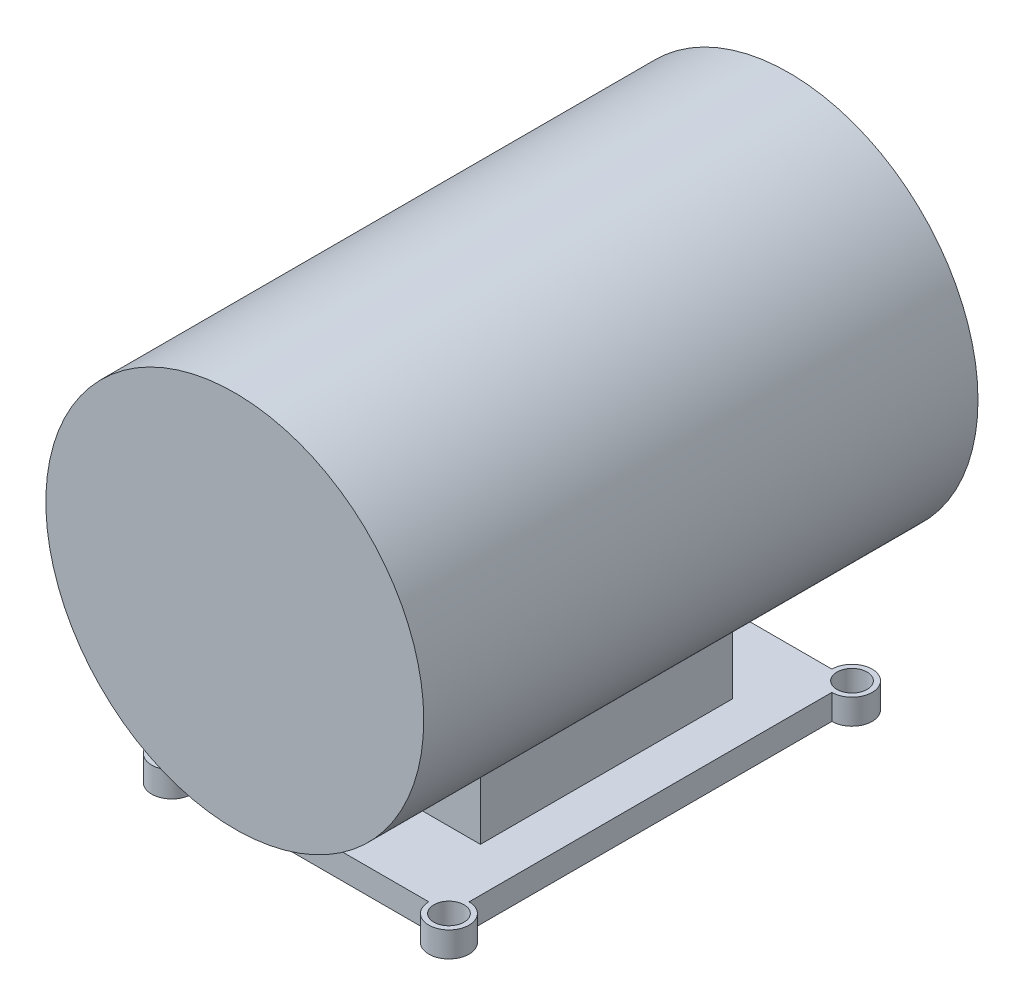
ISO-10303-21;
HEADER;
FILE_DESCRIPTION(('STEP AP214'),'2;1');
FILE_NAME('part.step','',(''),(''),'','','');
FILE_SCHEMA(('AUTOMOTIVE_DESIGN { 1 0 10303 214 1 1 1 1 }'));
ENDSEC;
DATA;
#1=APPLICATION_CONTEXT('core data for automotive mechanical design processes');
#2=APPLICATION_PROTOCOL_DEFINITION('international standard','automotive_design',2000,#1);
#3=PRODUCT_CONTEXT('',#1,'mechanical');
#4=PRODUCT('Part','Part','',(#3));
#5=PRODUCT_RELATED_PRODUCT_CATEGORY('part','',(#4));
#6=PRODUCT_DEFINITION_FORMATION('','',#4);
#7=PRODUCT_DEFINITION_CONTEXT('part definition',#1,'design');
#8=PRODUCT_DEFINITION('design','',#6,#7);
#9=PRODUCT_DEFINITION_SHAPE('','',#8);
#10=(LENGTH_UNIT() NAMED_UNIT(*) SI_UNIT(.MILLI.,.METRE.));
#11=(NAMED_UNIT(*) PLANE_ANGLE_UNIT() SI_UNIT($,.RADIAN.));
#12=(NAMED_UNIT(*) SI_UNIT($,.STERADIAN.) SOLID_ANGLE_UNIT());
#13=UNCERTAINTY_MEASURE_WITH_UNIT(LENGTH_MEASURE(1.E-05),#10,'distance_accuracy_value','');
#14=(GEOMETRIC_REPRESENTATION_CONTEXT(3) GLOBAL_UNCERTAINTY_ASSIGNED_CONTEXT((#13)) GLOBAL_UNIT_ASSIGNED_CONTEXT((#10,
#11,#12)) REPRESENTATION_CONTEXT('',''));
#15=CARTESIAN_POINT('',(0.,0.,0.));
#16=DIRECTION('',(0.,0.,1.));
#17=DIRECTION('',(1.,0.,0.));
#18=AXIS2_PLACEMENT_3D('',#15,#16,#17);
#19=CARTESIAN_POINT('',(55.,5.,-80.));
#20=DIRECTION('',(0.,1.,0.));
#21=DIRECTION('',(0.,0.,1.));
#22=AXIS2_PLACEMENT_3D('',#19,#20,#21);
#23=PLANE('',#22);
#24=CARTESIAN_POINT('',(-55.,5.,-80.));
#25=DIRECTION('',(0.,1.,0.));
#26=DIRECTION('',(0.,0.,1.));
#27=AXIS2_PLACEMENT_3D('',#24,#25,#26);
#28=CIRCLE('',#27,6.);
#29=CARTESIAN_POINT('',(-55.,5.,-74.));
#30=VERTEX_POINT('',#29);
#31=EDGE_CURVE('E168',#30,#30,#28,.T.);
#32=ORIENTED_EDGE('',*,*,#31,.F.);
#33=EDGE_LOOP('',(#32));
#34=FACE_BOUND('',#33,.T.);
#35=CARTESIAN_POINT('',(55.,5.,-80.));
#36=DIRECTION('',(0.,1.,0.));
#37=DIRECTION('',(0.,0.,1.));
#38=AXIS2_PLACEMENT_3D('',#35,#36,#37);
#39=CIRCLE('',#38,6.);
#40=CARTESIAN_POINT('',(55.,5.,-74.));
#41=VERTEX_POINT('',#40);
#42=EDGE_CURVE('E184',#41,#41,#39,.T.);
#43=ORIENTED_EDGE('',*,*,#42,.F.);
#44=EDGE_LOOP('',(#43));
#45=FACE_BOUND('',#44,.T.);
#46=CARTESIAN_POINT('',(55.,5.,-80.));
#47=DIRECTION('',(0.,1.,0.));
#48=DIRECTION('',(0.,0.,1.));
#49=AXIS2_PLACEMENT_3D('',#46,#47,#48);
#50=CIRCLE('',#49,8.00000000000001);
#51=CARTESIAN_POINT('',(55.,5.,-72.));
#52=VERTEX_POINT('',#51);
#53=CARTESIAN_POINT('',(47.,5.,-80.));
#54=VERTEX_POINT('',#53);
#55=EDGE_CURVE('E192',#52,#54,#50,.T.);
#56=ORIENTED_EDGE('',*,*,#55,.T.);
#57=DIRECTION('',(-1.,0.,0.));
#58=VECTOR('',#57,1.);
#59=CARTESIAN_POINT('',(-47.,5.,-80.));
#60=LINE('',#59,#58);
#61=CARTESIAN_POINT('',(-47.,5.,-80.));
#62=VERTEX_POINT('',#61);
#63=EDGE_CURVE('E196',#54,#62,#60,.T.);
#64=ORIENTED_EDGE('',*,*,#63,.T.);
#65=CARTESIAN_POINT('',(-55.,5.,-80.));
#66=DIRECTION('',(0.,1.,0.));
#67=DIRECTION('',(0.,0.,1.));
#68=AXIS2_PLACEMENT_3D('',#65,#66,#67);
#69=CIRCLE('',#68,8.);
#70=CARTESIAN_POINT('',(-55.,5.,-72.));
#71=VERTEX_POINT('',#70);
#72=EDGE_CURVE('E200',#62,#71,#69,.T.);
#73=ORIENTED_EDGE('',*,*,#72,.T.);
#74=DIRECTION('',(0.,0.,1.));
#75=VECTOR('',#74,1.);
#76=CARTESIAN_POINT('',(-55.,5.,-72.));
#77=LINE('',#76,#75);
#78=CARTESIAN_POINT('',(-55.,5.,71.9999999999999));
#79=VERTEX_POINT('',#78);
#80=EDGE_CURVE('E203',#71,#79,#77,.T.);
#81=ORIENTED_EDGE('',*,*,#80,.T.);
#82=CARTESIAN_POINT('',(-55.,5.,80.));
#83=DIRECTION('',(0.,1.,0.));
#84=DIRECTION('',(0.,0.,-1.));
#85=AXIS2_PLACEMENT_3D('',#82,#83,#84);
#86=CIRCLE('',#85,8.00000000000003);
#87=CARTESIAN_POINT('',(-47.,5.,79.9999999999999));
#88=VERTEX_POINT('',#87);
#89=EDGE_CURVE('E206',#79,#88,#86,.T.);
#90=ORIENTED_EDGE('',*,*,#89,.T.);
#91=DIRECTION('',(1.,0.,0.));
#92=VECTOR('',#91,1.);
#93=CARTESIAN_POINT('',(-47.,5.,79.9999999999999));
#94=LINE('',#93,#92);
#95=CARTESIAN_POINT('',(47.,5.,79.9999999999999));
#96=VERTEX_POINT('',#95);
#97=EDGE_CURVE('E209',#88,#96,#94,.T.);
#98=ORIENTED_EDGE('',*,*,#97,.T.);
#99=CARTESIAN_POINT('',(55.,5.,80.));
#100=DIRECTION('',(0.,1.,0.));
#101=DIRECTION('',(0.,0.,-1.));
#102=AXIS2_PLACEMENT_3D('',#99,#100,#101);
#103=CIRCLE('',#102,8.00000000000006);
#104=CARTESIAN_POINT('',(55.,5.,72.));
#105=VERTEX_POINT('',#104);
#106=EDGE_CURVE('E212',#96,#105,#103,.T.);
#107=ORIENTED_EDGE('',*,*,#106,.T.);
#108=DIRECTION('',(0.,0.,-1.));
#109=VECTOR('',#108,1.);
#110=CARTESIAN_POINT('',(55.,5.,-72.));
#111=LINE('',#110,#109);
#112=EDGE_CURVE('E215',#105,#52,#111,.T.);
#113=ORIENTED_EDGE('',*,*,#112,.T.);
#114=EDGE_LOOP('',(#56,#64,#73,#81,#90,#98,#107,#113));
#115=FACE_BOUND('',#114,.T.);
#116=CARTESIAN_POINT('',(55.,5.,80.));
#117=DIRECTION('',(0.,1.,0.));
#118=DIRECTION('',(0.,0.,-1.));
#119=AXIS2_PLACEMENT_3D('',#116,#117,#118);
#120=CIRCLE('',#119,5.99999999999995);
#121=CARTESIAN_POINT('',(55.,5.,74.0000000000001));
#122=VERTEX_POINT('',#121);
#123=EDGE_CURVE('E176',#122,#122,#120,.T.);
#124=ORIENTED_EDGE('',*,*,#123,.F.);
#125=EDGE_LOOP('',(#124));
#126=FACE_BOUND('',#125,.T.);
#127=CARTESIAN_POINT('',(-55.,5.,80.));
#128=DIRECTION('',(0.,1.,0.));
#129=DIRECTION('',(0.,0.,-1.));
#130=AXIS2_PLACEMENT_3D('',#127,#128,#129);
#131=CIRCLE('',#130,5.99999999999995);
#132=CARTESIAN_POINT('',(-55.,5.,74.0000000000001));
#133=VERTEX_POINT('',#132);
#134=EDGE_CURVE('E160',#133,#133,#131,.T.);
#135=ORIENTED_EDGE('',*,*,#134,.F.);
#136=EDGE_LOOP('',(#135));
#137=FACE_BOUND('',#136,.T.);
#138=DIRECTION('',(-1.,0.,0.));
#139=VECTOR('',#138,1.);
#140=CARTESIAN_POINT('',(-37.5,5.,-50.));
#141=LINE('',#140,#139);
#142=CARTESIAN_POINT('',(37.5,5.,-50.));
#143=VERTEX_POINT('',#142);
#144=CARTESIAN_POINT('',(-37.5,5.,-50.));
#145=VERTEX_POINT('',#144);
#146=EDGE_CURVE('E514',#143,#145,#141,.T.);
#147=ORIENTED_EDGE('',*,*,#146,.F.);
#148=DIRECTION('',(0.,0.,-1.));
#149=VECTOR('',#148,1.);
#150=CARTESIAN_POINT('',(37.5,5.,-50.));
#151=LINE('',#150,#149);
#152=CARTESIAN_POINT('',(37.5,5.,50.));
#153=VERTEX_POINT('',#152);
#154=EDGE_CURVE('E138',#153,#143,#151,.T.);
#155=ORIENTED_EDGE('',*,*,#154,.F.);
#156=DIRECTION('',(1.,0.,0.));
#157=VECTOR('',#156,1.);
#158=CARTESIAN_POINT('',(-37.5,5.,50.));
#159=LINE('',#158,#157);
#160=CARTESIAN_POINT('',(-37.5,5.,50.));
#161=VERTEX_POINT('',#160);
#162=EDGE_CURVE('E143',#161,#153,#159,.T.);
#163=ORIENTED_EDGE('',*,*,#162,.F.);
#164=DIRECTION('',(0.,0.,1.));
#165=VECTOR('',#164,1.);
#166=CARTESIAN_POINT('',(-37.5,5.,-50.));
#167=LINE('',#166,#165);
#168=EDGE_CURVE('E151',#145,#161,#167,.T.);
#169=ORIENTED_EDGE('',*,*,#168,.F.);
#170=EDGE_LOOP('',(#147,#155,#163,#169));
#171=FACE_BOUND('',#170,.T.);
#172=ADVANCED_FACE('F39',(#34,#45,#115,#126,#137,#171),#23,.T.);
#173=CARTESIAN_POINT('',(55.,-5.,-80.));
#174=DIRECTION('',(0.,1.,0.));
#175=DIRECTION('',(0.,0.,1.));
#176=AXIS2_PLACEMENT_3D('',#173,#174,#175);
#177=PLANE('',#176);
#178=CARTESIAN_POINT('',(55.,-5.,-80.));
#179=DIRECTION('',(0.,1.,0.));
#180=DIRECTION('',(0.,0.,1.));
#181=AXIS2_PLACEMENT_3D('',#178,#179,#180);
#182=CIRCLE('',#181,8.00000000000001);
#183=CARTESIAN_POINT('',(55.,-5.,-72.));
#184=VERTEX_POINT('',#183);
#185=CARTESIAN_POINT('',(47.,-5.,-80.));
#186=VERTEX_POINT('',#185);
#187=EDGE_CURVE('E188',#184,#186,#182,.T.);
#188=ORIENTED_EDGE('',*,*,#187,.F.);
#189=DIRECTION('',(0.,0.,-1.));
#190=VECTOR('',#189,1.);
#191=CARTESIAN_POINT('',(55.,-5.,-72.));
#192=LINE('',#191,#190);
#193=CARTESIAN_POINT('',(55.,-5.,72.));
#194=VERTEX_POINT('',#193);
#195=EDGE_CURVE('E197',#194,#184,#192,.T.);
#196=ORIENTED_EDGE('',*,*,#195,.F.);
#197=CARTESIAN_POINT('',(55.,-5.,80.));
#198=DIRECTION('',(0.,1.,0.));
#199=DIRECTION('',(0.,0.,-1.));
#200=AXIS2_PLACEMENT_3D('',#197,#198,#199);
#201=CIRCLE('',#200,8.00000000000006);
#202=CARTESIAN_POINT('',(47.,-5.,79.9999999999999));
#203=VERTEX_POINT('',#202);
#204=EDGE_CURVE('E237',#203,#194,#201,.T.);
#205=ORIENTED_EDGE('',*,*,#204,.F.);
#206=DIRECTION('',(1.,0.,0.));
#207=VECTOR('',#206,1.);
#208=CARTESIAN_POINT('',(-47.,-5.,79.9999999999999));
#209=LINE('',#208,#207);
#210=CARTESIAN_POINT('',(-47.,-5.,79.9999999999999));
#211=VERTEX_POINT('',#210);
#212=EDGE_CURVE('E234',#211,#203,#209,.T.);
#213=ORIENTED_EDGE('',*,*,#212,.F.);
#214=CARTESIAN_POINT('',(-55.,-5.,80.));
#215=DIRECTION('',(0.,1.,0.));
#216=DIRECTION('',(0.,0.,-1.));
#217=AXIS2_PLACEMENT_3D('',#214,#215,#216);
#218=CIRCLE('',#217,8.00000000000003);
#219=CARTESIAN_POINT('',(-55.,-5.,71.9999999999999));
#220=VERTEX_POINT('',#219);
#221=EDGE_CURVE('E231',#220,#211,#218,.T.);
#222=ORIENTED_EDGE('',*,*,#221,.F.);
#223=DIRECTION('',(0.,0.,1.));
#224=VECTOR('',#223,1.);
#225=CARTESIAN_POINT('',(-55.,-5.,-72.));
#226=LINE('',#225,#224);
#227=CARTESIAN_POINT('',(-55.,-5.,-72.));
#228=VERTEX_POINT('',#227);
#229=EDGE_CURVE('E228',#228,#220,#226,.T.);
#230=ORIENTED_EDGE('',*,*,#229,.F.);
#231=CARTESIAN_POINT('',(-55.,-5.,-80.));
#232=DIRECTION('',(0.,1.,0.));
#233=DIRECTION('',(0.,0.,1.));
#234=AXIS2_PLACEMENT_3D('',#231,#232,#233);
#235=CIRCLE('',#234,8.);
#236=CARTESIAN_POINT('',(-47.,-5.,-80.));
#237=VERTEX_POINT('',#236);
#238=EDGE_CURVE('E225',#237,#228,#235,.T.);
#239=ORIENTED_EDGE('',*,*,#238,.F.);
#240=DIRECTION('',(-1.,0.,0.));
#241=VECTOR('',#240,1.);
#242=CARTESIAN_POINT('',(-47.,-5.,-80.));
#243=LINE('',#242,#241);
#244=EDGE_CURVE('E222',#186,#237,#243,.T.);
#245=ORIENTED_EDGE('',*,*,#244,.F.);
#246=EDGE_LOOP('',(#188,#196,#205,#213,#222,#230,#239,#245));
#247=FACE_BOUND('',#246,.T.);
#248=CARTESIAN_POINT('',(55.,-5.,-80.));
#249=DIRECTION('',(0.,1.,0.));
#250=DIRECTION('',(0.,0.,1.));
#251=AXIS2_PLACEMENT_3D('',#248,#249,#250);
#252=CIRCLE('',#251,6.);
#253=CARTESIAN_POINT('',(55.,-5.,-74.));
#254=VERTEX_POINT('',#253);
#255=EDGE_CURVE('E180',#254,#254,#252,.T.);
#256=ORIENTED_EDGE('',*,*,#255,.T.);
#257=EDGE_LOOP('',(#256));
#258=FACE_BOUND('',#257,.T.);
#259=CARTESIAN_POINT('',(55.,-5.,80.));
#260=DIRECTION('',(0.,1.,0.));
#261=DIRECTION('',(0.,0.,-1.));
#262=AXIS2_PLACEMENT_3D('',#259,#260,#261);
#263=CIRCLE('',#262,5.99999999999995);
#264=CARTESIAN_POINT('',(55.,-5.,74.0000000000001));
#265=VERTEX_POINT('',#264);
#266=EDGE_CURVE('E172',#265,#265,#263,.T.);
#267=ORIENTED_EDGE('',*,*,#266,.T.);
#268=EDGE_LOOP('',(#267));
#269=FACE_BOUND('',#268,.T.);
#270=CARTESIAN_POINT('',(-55.,-5.,-80.));
#271=DIRECTION('',(0.,1.,0.));
#272=DIRECTION('',(0.,0.,1.));
#273=AXIS2_PLACEMENT_3D('',#270,#271,#272);
#274=CIRCLE('',#273,6.);
#275=CARTESIAN_POINT('',(-55.,-5.,-74.));
#276=VERTEX_POINT('',#275);
#277=EDGE_CURVE('E164',#276,#276,#274,.T.);
#278=ORIENTED_EDGE('',*,*,#277,.T.);
#279=EDGE_LOOP('',(#278));
#280=FACE_BOUND('',#279,.T.);
#281=CARTESIAN_POINT('',(-55.,-5.,80.));
#282=DIRECTION('',(0.,1.,0.));
#283=DIRECTION('',(0.,0.,-1.));
#284=AXIS2_PLACEMENT_3D('',#281,#282,#283);
#285=CIRCLE('',#284,5.99999999999995);
#286=CARTESIAN_POINT('',(-55.,-5.,74.0000000000001));
#287=VERTEX_POINT('',#286);
#288=EDGE_CURVE('E159',#287,#287,#285,.T.);
#289=ORIENTED_EDGE('',*,*,#288,.T.);
#290=EDGE_LOOP('',(#289));
#291=FACE_BOUND('',#290,.T.);
#292=ADVANCED_FACE('F280',(#247,#258,#269,#280,#291),#177,.F.);
#293=CARTESIAN_POINT('',(55.,5.,-80.));
#294=DIRECTION('',(0.,-1.,0.));
#295=DIRECTION('',(0.,0.,-1.));
#296=AXIS2_PLACEMENT_3D('',#293,#294,#295);
#297=CYLINDRICAL_SURFACE('',#296,8.00000000000001);
#298=ORIENTED_EDGE('',*,*,#187,.T.);
#299=DIRECTION('',(0.,-1.,0.));
#300=VECTOR('',#299,1.);
#301=CARTESIAN_POINT('',(47.,5.,-80.));
#302=LINE('',#301,#300);
#303=EDGE_CURVE('E48',#54,#186,#302,.T.);
#304=ORIENTED_EDGE('',*,*,#303,.F.);
#305=ORIENTED_EDGE('',*,*,#55,.F.);
#306=DIRECTION('',(0.,-1.,0.));
#307=VECTOR('',#306,1.);
#308=CARTESIAN_POINT('',(55.,5.,-72.));
#309=LINE('',#308,#307);
#310=EDGE_CURVE('E218',#52,#184,#309,.T.);
#311=ORIENTED_EDGE('',*,*,#310,.T.);
#312=EDGE_LOOP('',(#298,#304,#305,#311));
#313=FACE_BOUND('',#312,.T.);
#314=ADVANCED_FACE('F41',(#313),#297,.T.);
#315=CARTESIAN_POINT('',(-47.,5.,-80.));
#316=DIRECTION('',(0.,0.,1.));
#317=DIRECTION('',(1.,0.,0.));
#318=AXIS2_PLACEMENT_3D('',#315,#316,#317);
#319=PLANE('',#318);
#320=ORIENTED_EDGE('',*,*,#244,.T.);
#321=DIRECTION('',(0.,-1.,0.));
#322=VECTOR('',#321,1.);
#323=CARTESIAN_POINT('',(-47.,5.,-80.));
#324=LINE('',#323,#322);
#325=EDGE_CURVE('E265',#62,#237,#324,.T.);
#326=ORIENTED_EDGE('',*,*,#325,.F.);
#327=ORIENTED_EDGE('',*,*,#63,.F.);
#328=ORIENTED_EDGE('',*,*,#303,.T.);
#329=EDGE_LOOP('',(#320,#326,#327,#328));
#330=FACE_BOUND('',#329,.T.);
#331=ADVANCED_FACE('F272',(#330),#319,.F.);
#332=CARTESIAN_POINT('',(-55.,5.,-80.));
#333=DIRECTION('',(0.,-1.,0.));
#334=DIRECTION('',(0.,0.,-1.));
#335=AXIS2_PLACEMENT_3D('',#332,#333,#334);
#336=CYLINDRICAL_SURFACE('',#335,8.);
#337=ORIENTED_EDGE('',*,*,#238,.T.);
#338=DIRECTION('',(0.,-1.,0.));
#339=VECTOR('',#338,1.);
#340=CARTESIAN_POINT('',(-55.,5.,-72.));
#341=LINE('',#340,#339);
#342=EDGE_CURVE('E261',#71,#228,#341,.T.);
#343=ORIENTED_EDGE('',*,*,#342,.F.);
#344=ORIENTED_EDGE('',*,*,#72,.F.);
#345=ORIENTED_EDGE('',*,*,#325,.T.);
#346=EDGE_LOOP('',(#337,#343,#344,#345));
#347=FACE_BOUND('',#346,.T.);
#348=ADVANCED_FACE('F288',(#347),#336,.T.);
#349=CARTESIAN_POINT('',(-55.,5.,-72.));
#350=DIRECTION('',(1.,0.,0.));
#351=DIRECTION('',(0.,0.,-1.));
#352=AXIS2_PLACEMENT_3D('',#349,#350,#351);
#353=PLANE('',#352);
#354=ORIENTED_EDGE('',*,*,#229,.T.);
#355=DIRECTION('',(0.,-1.,0.));
#356=VECTOR('',#355,1.);
#357=CARTESIAN_POINT('',(-55.,5.,71.9999999999999));
#358=LINE('',#357,#356);
#359=EDGE_CURVE('E257',#79,#220,#358,.T.);
#360=ORIENTED_EDGE('',*,*,#359,.F.);
#361=ORIENTED_EDGE('',*,*,#80,.F.);
#362=ORIENTED_EDGE('',*,*,#342,.T.);
#363=EDGE_LOOP('',(#354,#360,#361,#362));
#364=FACE_BOUND('',#363,.T.);
#365=ADVANCED_FACE('F292',(#364),#353,.F.);
#366=CARTESIAN_POINT('',(-55.,5.,80.));
#367=DIRECTION('',(0.,-1.,0.));
#368=DIRECTION('',(0.,0.,-1.));
#369=AXIS2_PLACEMENT_3D('',#366,#367,#368);
#370=CYLINDRICAL_SURFACE('',#369,8.00000000000003);
#371=ORIENTED_EDGE('',*,*,#221,.T.);
#372=DIRECTION('',(0.,-1.,0.));
#373=VECTOR('',#372,1.);
#374=CARTESIAN_POINT('',(-47.,5.,79.9999999999999));
#375=LINE('',#374,#373);
#376=EDGE_CURVE('E253',#88,#211,#375,.T.);
#377=ORIENTED_EDGE('',*,*,#376,.F.);
#378=ORIENTED_EDGE('',*,*,#89,.F.);
#379=ORIENTED_EDGE('',*,*,#359,.T.);
#380=EDGE_LOOP('',(#371,#377,#378,#379));
#381=FACE_BOUND('',#380,.T.);
#382=ADVANCED_FACE('F311',(#381),#370,.T.);
#383=CARTESIAN_POINT('',(-47.,5.,79.9999999999999));
#384=DIRECTION('',(0.,0.,-1.));
#385=DIRECTION('',(-1.,0.,0.));
#386=AXIS2_PLACEMENT_3D('',#383,#384,#385);
#387=PLANE('',#386);
#388=ORIENTED_EDGE('',*,*,#212,.T.);
#389=DIRECTION('',(0.,-1.,0.));
#390=VECTOR('',#389,1.);
#391=CARTESIAN_POINT('',(47.,5.,79.9999999999999));
#392=LINE('',#391,#390);
#393=EDGE_CURVE('E249',#96,#203,#392,.T.);
#394=ORIENTED_EDGE('',*,*,#393,.F.);
#395=ORIENTED_EDGE('',*,*,#97,.F.);
#396=ORIENTED_EDGE('',*,*,#376,.T.);
#397=EDGE_LOOP('',(#388,#394,#395,#396));
#398=FACE_BOUND('',#397,.T.);
#399=ADVANCED_FACE('F308',(#398),#387,.F.);
#400=CARTESIAN_POINT('',(55.,5.,80.));
#401=DIRECTION('',(0.,-1.,0.));
#402=DIRECTION('',(0.,0.,-1.));
#403=AXIS2_PLACEMENT_3D('',#400,#401,#402);
#404=CYLINDRICAL_SURFACE('',#403,8.00000000000006);
#405=ORIENTED_EDGE('',*,*,#204,.T.);
#406=DIRECTION('',(0.,-1.,0.));
#407=VECTOR('',#406,1.);
#408=CARTESIAN_POINT('',(55.,5.,72.));
#409=LINE('',#408,#407);
#410=EDGE_CURVE('E245',#105,#194,#409,.T.);
#411=ORIENTED_EDGE('',*,*,#410,.F.);
#412=ORIENTED_EDGE('',*,*,#106,.F.);
#413=ORIENTED_EDGE('',*,*,#393,.T.);
#414=EDGE_LOOP('',(#405,#411,#412,#413));
#415=FACE_BOUND('',#414,.T.);
#416=ADVANCED_FACE('F304',(#415),#404,.T.);
#417=CARTESIAN_POINT('',(55.,5.,-72.));
#418=DIRECTION('',(-1.,0.,0.));
#419=DIRECTION('',(0.,0.,1.));
#420=AXIS2_PLACEMENT_3D('',#417,#418,#419);
#421=PLANE('',#420);
#422=ORIENTED_EDGE('',*,*,#195,.T.);
#423=ORIENTED_EDGE('',*,*,#310,.F.);
#424=ORIENTED_EDGE('',*,*,#112,.F.);
#425=ORIENTED_EDGE('',*,*,#410,.T.);
#426=EDGE_LOOP('',(#422,#423,#424,#425));
#427=FACE_BOUND('',#426,.T.);
#428=ADVANCED_FACE('F302',(#427),#421,.F.);
#429=CARTESIAN_POINT('',(55.,5.,-80.));
#430=DIRECTION('',(0.,-1.,0.));
#431=DIRECTION('',(0.,0.,-1.));
#432=AXIS2_PLACEMENT_3D('',#429,#430,#431);
#433=CYLINDRICAL_SURFACE('',#432,6.);
#434=ORIENTED_EDGE('',*,*,#42,.T.);
#435=EDGE_LOOP('',(#434));
#436=FACE_BOUND('',#435,.T.);
#437=ORIENTED_EDGE('',*,*,#255,.F.);
#438=EDGE_LOOP('',(#437));
#439=FACE_BOUND('',#438,.T.);
#440=ADVANCED_FACE('F330',(#436,#439),#433,.F.);
#441=CARTESIAN_POINT('',(55.,5.,80.));
#442=DIRECTION('',(0.,-1.,0.));
#443=DIRECTION('',(0.,0.,-1.));
#444=AXIS2_PLACEMENT_3D('',#441,#442,#443);
#445=CYLINDRICAL_SURFACE('',#444,5.99999999999995);
#446=ORIENTED_EDGE('',*,*,#123,.T.);
#447=EDGE_LOOP('',(#446));
#448=FACE_BOUND('',#447,.T.);
#449=ORIENTED_EDGE('',*,*,#266,.F.);
#450=EDGE_LOOP('',(#449));
#451=FACE_BOUND('',#450,.T.);
#452=ADVANCED_FACE('F350',(#448,#451),#445,.F.);
#453=CARTESIAN_POINT('',(-55.,5.,-80.));
#454=DIRECTION('',(0.,-1.,0.));
#455=DIRECTION('',(0.,0.,-1.));
#456=AXIS2_PLACEMENT_3D('',#453,#454,#455);
#457=CYLINDRICAL_SURFACE('',#456,6.);
#458=ORIENTED_EDGE('',*,*,#31,.T.);
#459=EDGE_LOOP('',(#458));
#460=FACE_BOUND('',#459,.T.);
#461=ORIENTED_EDGE('',*,*,#277,.F.);
#462=EDGE_LOOP('',(#461));
#463=FACE_BOUND('',#462,.T.);
#464=ADVANCED_FACE('F357',(#460,#463),#457,.F.);
#465=CARTESIAN_POINT('',(-55.,5.,80.));
#466=DIRECTION('',(0.,-1.,0.));
#467=DIRECTION('',(0.,0.,-1.));
#468=AXIS2_PLACEMENT_3D('',#465,#466,#467);
#469=CYLINDRICAL_SURFACE('',#468,5.99999999999995);
#470=ORIENTED_EDGE('',*,*,#134,.T.);
#471=EDGE_LOOP('',(#470));
#472=FACE_BOUND('',#471,.T.);
#473=ORIENTED_EDGE('',*,*,#288,.F.);
#474=EDGE_LOOP('',(#473));
#475=FACE_BOUND('',#474,.T.);
#476=ADVANCED_FACE('F364',(#472,#475),#469,.F.);
#477=CARTESIAN_POINT('',(37.5,35.,-50.));
#478=DIRECTION('',(-1.,0.,0.));
#479=DIRECTION('',(0.,0.,1.));
#480=AXIS2_PLACEMENT_3D('',#477,#478,#479);
#481=PLANE('',#480);
#482=DIRECTION('',(0.,-1.,0.));
#483=VECTOR('',#482,1.);
#484=CARTESIAN_POINT('',(37.5,35.,-50.));
#485=LINE('',#484,#483);
#486=CARTESIAN_POINT('',(37.5,31.5480947161671,-50.));
#487=VERTEX_POINT('',#486);
#488=EDGE_CURVE('E136',#487,#143,#485,.T.);
#489=ORIENTED_EDGE('',*,*,#488,.F.);
#490=DIRECTION('',(0.,0.,1.));
#491=VECTOR('',#490,1.);
#492=CARTESIAN_POINT('',(37.5,31.5480947161671,-110.));
#493=LINE('',#492,#491);
#494=CARTESIAN_POINT('',(37.5,31.5480947161671,50.));
#495=VERTEX_POINT('',#494);
#496=EDGE_CURVE('E128',#487,#495,#493,.T.);
#497=ORIENTED_EDGE('',*,*,#496,.T.);
#498=DIRECTION('',(0.,-1.,0.));
#499=VECTOR('',#498,1.);
#500=CARTESIAN_POINT('',(37.5,35.,50.));
#501=LINE('',#500,#499);
#502=EDGE_CURVE('E135',#495,#153,#501,.T.);
#503=ORIENTED_EDGE('',*,*,#502,.T.);
#504=ORIENTED_EDGE('',*,*,#154,.T.);
#505=EDGE_LOOP('',(#489,#497,#503,#504));
#506=FACE_BOUND('',#505,.T.);
#507=ADVANCED_FACE('F133',(#506),#481,.F.);
#508=CARTESIAN_POINT('',(-37.5,35.,-50.));
#509=DIRECTION('',(0.,0.,1.));
#510=DIRECTION('',(1.,0.,0.));
#511=AXIS2_PLACEMENT_3D('',#508,#509,#510);
#512=PLANE('',#511);
#513=DIRECTION('',(0.,-1.,0.));
#514=VECTOR('',#513,1.);
#515=CARTESIAN_POINT('',(-37.5,35.,-50.));
#516=LINE('',#515,#514);
#517=CARTESIAN_POINT('',(-37.5,31.5480947161671,-50.));
#518=VERTEX_POINT('',#517);
#519=EDGE_CURVE('E149',#518,#145,#516,.T.);
#520=ORIENTED_EDGE('',*,*,#519,.F.);
#521=CARTESIAN_POINT('',(0.,96.5,-50.));
#522=DIRECTION('',(0.,0.,1.));
#523=DIRECTION('',(1.,0.,0.));
#524=AXIS2_PLACEMENT_3D('',#521,#522,#523);
#525=CIRCLE('',#524,75.);
#526=EDGE_CURVE('E139',#518,#487,#525,.T.);
#527=ORIENTED_EDGE('',*,*,#526,.T.);
#528=ORIENTED_EDGE('',*,*,#488,.T.);
#529=ORIENTED_EDGE('',*,*,#146,.T.);
#530=EDGE_LOOP('',(#520,#527,#528,#529));
#531=FACE_BOUND('',#530,.T.);
#532=ADVANCED_FACE('F379',(#531),#512,.F.);
#533=CARTESIAN_POINT('',(-37.5,35.,-50.));
#534=DIRECTION('',(1.,0.,0.));
#535=DIRECTION('',(0.,0.,-1.));
#536=AXIS2_PLACEMENT_3D('',#533,#534,#535);
#537=PLANE('',#536);
#538=DIRECTION('',(0.,-1.,0.));
#539=VECTOR('',#538,1.);
#540=CARTESIAN_POINT('',(-37.5,35.,50.));
#541=LINE('',#540,#539);
#542=CARTESIAN_POINT('',(-37.5,31.5480947161671,50.));
#543=VERTEX_POINT('',#542);
#544=EDGE_CURVE('E61',#543,#161,#541,.T.);
#545=ORIENTED_EDGE('',*,*,#544,.F.);
#546=DIRECTION('',(0.,0.,1.));
#547=VECTOR('',#546,1.);
#548=CARTESIAN_POINT('',(-37.5,31.5480947161671,-110.));
#549=LINE('',#548,#547);
#550=EDGE_CURVE('E55',#543,#518,#549,.F.);
#551=ORIENTED_EDGE('',*,*,#550,.T.);
#552=ORIENTED_EDGE('',*,*,#519,.T.);
#553=ORIENTED_EDGE('',*,*,#168,.T.);
#554=EDGE_LOOP('',(#545,#551,#552,#553));
#555=FACE_BOUND('',#554,.T.);
#556=ADVANCED_FACE('F386',(#555),#537,.F.);
#557=CARTESIAN_POINT('',(-37.5,35.,50.));
#558=DIRECTION('',(0.,0.,-1.));
#559=DIRECTION('',(-1.,0.,0.));
#560=AXIS2_PLACEMENT_3D('',#557,#558,#559);
#561=PLANE('',#560);
#562=ORIENTED_EDGE('',*,*,#502,.F.);
#563=CARTESIAN_POINT('',(0.,96.5,50.));
#564=DIRECTION('',(0.,0.,-1.));
#565=DIRECTION('',(-1.,0.,0.));
#566=AXIS2_PLACEMENT_3D('',#563,#564,#565);
#567=CIRCLE('',#566,75.);
#568=EDGE_CURVE('E11',#495,#543,#567,.T.);
#569=ORIENTED_EDGE('',*,*,#568,.T.);
#570=ORIENTED_EDGE('',*,*,#544,.T.);
#571=ORIENTED_EDGE('',*,*,#162,.T.);
#572=EDGE_LOOP('',(#562,#569,#570,#571));
#573=FACE_BOUND('',#572,.T.);
#574=ADVANCED_FACE('F141',(#573),#561,.F.);
#575=CARTESIAN_POINT('',(0.,96.5,-110.));
#576=DIRECTION('',(0.,0.,1.));
#577=DIRECTION('',(1.,0.,0.));
#578=AXIS2_PLACEMENT_3D('',#575,#576,#577);
#579=CYLINDRICAL_SURFACE('',#578,75.);
#580=CARTESIAN_POINT('',(0.,96.5,110.));
#581=DIRECTION('',(0.,0.,1.));
#582=DIRECTION('',(1.,0.,0.));
#583=AXIS2_PLACEMENT_3D('',#580,#581,#582);
#584=CIRCLE('',#583,75.);
#585=CARTESIAN_POINT('',(75.,96.5,110.));
#586=VERTEX_POINT('',#585);
#587=EDGE_CURVE('E500',#586,#586,#584,.T.);
#588=ORIENTED_EDGE('',*,*,#587,.F.);
#589=EDGE_LOOP('',(#588));
#590=FACE_BOUND('',#589,.T.);
#591=CARTESIAN_POINT('',(0.,96.5,-110.));
#592=DIRECTION('',(0.,0.,1.));
#593=DIRECTION('',(1.,0.,0.));
#594=AXIS2_PLACEMENT_3D('',#591,#592,#593);
#595=CIRCLE('',#594,75.);
#596=CARTESIAN_POINT('',(75.,96.5,-110.));
#597=VERTEX_POINT('',#596);
#598=EDGE_CURVE('E502',#597,#597,#595,.T.);
#599=ORIENTED_EDGE('',*,*,#598,.T.);
#600=EDGE_LOOP('',(#599));
#601=FACE_BOUND('',#600,.T.);
#602=ORIENTED_EDGE('',*,*,#496,.F.);
#603=ORIENTED_EDGE('',*,*,#526,.F.);
#604=ORIENTED_EDGE('',*,*,#550,.F.);
#605=ORIENTED_EDGE('',*,*,#568,.F.);
#606=EDGE_LOOP('',(#602,#603,#604,#605));
#607=FACE_BOUND('',#606,.T.);
#608=ADVANCED_FACE('F127',(#590,#601,#607),#579,.T.);
#609=CARTESIAN_POINT('',(0.,96.5,-110.));
#610=DIRECTION('',(0.,0.,1.));
#611=DIRECTION('',(1.,0.,0.));
#612=AXIS2_PLACEMENT_3D('',#609,#610,#611);
#613=PLANE('',#612);
#614=ORIENTED_EDGE('',*,*,#598,.F.);
#615=EDGE_LOOP('',(#614));
#616=FACE_BOUND('',#615,.T.);
#617=ADVANCED_FACE('F407',(#616),#613,.F.);
#618=CARTESIAN_POINT('',(0.,96.5,110.));
#619=DIRECTION('',(0.,0.,1.));
#620=DIRECTION('',(1.,0.,0.));
#621=AXIS2_PLACEMENT_3D('',#618,#619,#620);
#622=PLANE('',#621);
#623=ORIENTED_EDGE('',*,*,#587,.T.);
#624=EDGE_LOOP('',(#623));
#625=FACE_BOUND('',#624,.T.);
#626=ADVANCED_FACE('F415',(#625),#622,.T.);
#627=CLOSED_SHELL('',(#172,#292,#314,#331,#348,#365,#382,#399,#416,#428,#440,#452,#464,#476,
#507,#532,#556,#574,#608,#617,#626));
#628=MANIFOLD_SOLID_BREP('B2',#627);
#629=ADVANCED_BREP_SHAPE_REPRESENTATION('',(#18,#628),#14);
#630=SHAPE_DEFINITION_REPRESENTATION(#9,#629);
ENDSEC;
END-ISO-10303-21;
